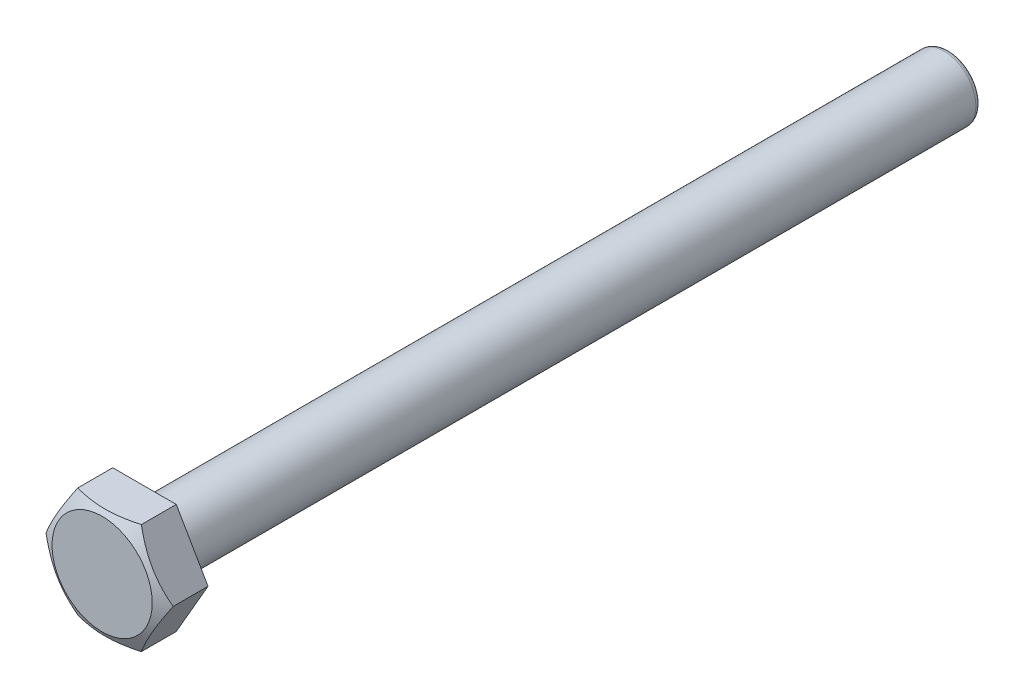
ISO-10303-21;
HEADER;
FILE_DESCRIPTION(('STEP AP214'),'2;1');
FILE_NAME('part.step','',(''),(''),'','','');
FILE_SCHEMA(('AUTOMOTIVE_DESIGN { 1 0 10303 214 1 1 1 1 }'));
ENDSEC;
DATA;
#1=APPLICATION_CONTEXT('core data for automotive mechanical design processes');
#2=APPLICATION_PROTOCOL_DEFINITION('international standard','automotive_design',2000,#1);
#3=PRODUCT_CONTEXT('',#1,'mechanical');
#4=PRODUCT('Part','Part','',(#3));
#5=PRODUCT_RELATED_PRODUCT_CATEGORY('part','',(#4));
#6=PRODUCT_DEFINITION_FORMATION('','',#4);
#7=PRODUCT_DEFINITION_CONTEXT('part definition',#1,'design');
#8=PRODUCT_DEFINITION('design','',#6,#7);
#9=PRODUCT_DEFINITION_SHAPE('','',#8);
#10=(LENGTH_UNIT() NAMED_UNIT(*) SI_UNIT(.MILLI.,.METRE.));
#11=(NAMED_UNIT(*) PLANE_ANGLE_UNIT() SI_UNIT($,.RADIAN.));
#12=(NAMED_UNIT(*) SI_UNIT($,.STERADIAN.) SOLID_ANGLE_UNIT());
#13=UNCERTAINTY_MEASURE_WITH_UNIT(LENGTH_MEASURE(1.E-05),#10,'distance_accuracy_value','');
#14=(GEOMETRIC_REPRESENTATION_CONTEXT(3) GLOBAL_UNCERTAINTY_ASSIGNED_CONTEXT((#13)) GLOBAL_UNIT_ASSIGNED_CONTEXT((#10,
#11,#12)) REPRESENTATION_CONTEXT('',''));
#15=CARTESIAN_POINT('',(0.,0.,0.));
#16=DIRECTION('',(0.,0.,1.));
#17=DIRECTION('',(1.,0.,0.));
#18=AXIS2_PLACEMENT_3D('',#15,#16,#17);
#19=CARTESIAN_POINT('',(3.00000000000005,-5.19615242270659,4.));
#20=DIRECTION('',(-0.866025403784442,0.499999999999995,0.));
#21=DIRECTION('',(-0.499999999999995,-0.866025403784442,0.));
#22=AXIS2_PLACEMENT_3D('',#19,#20,#21);
#23=PLANE('',#22);
#24=CARTESIAN_POINT('',(2.99988452994622,-5.19635242270659,3.29993636752852));
#25=CARTESIAN_POINT('',(3.13120037425521,-4.96890670852461,3.37231821520058));
#26=CARTESIAN_POINT('',(3.26353944494433,-4.73968871426459,3.43812150944553));
#27=CARTESIAN_POINT('',(3.53029736264474,-4.27765044748621,3.55301887201268));
#28=CARTESIAN_POINT('',(3.6647200634845,-4.04482349994109,3.60207677825998));
#29=CARTESIAN_POINT('',(3.93206789695309,-3.58176346908004,3.67871603562647));
#30=CARTESIAN_POINT('',(4.06495857356462,-3.35159006533665,3.70675619592674));
#31=CARTESIAN_POINT('',(4.26473017311514,-3.00557550500584,3.73217837172106));
#32=CARTESIAN_POINT('',(4.33136469480456,-2.89016112790172,3.73788053333798));
#33=CARTESIAN_POINT('',(4.46469401785052,-2.65922796624735,3.74364269272623));
#34=CARTESIAN_POINT('',(4.53138881755607,-2.5437091845567,3.74370284061096));
#35=CARTESIAN_POINT('',(4.71539831783398,-2.224995381,3.7360427664145));
#36=CARTESIAN_POINT('',(4.83266210158002,-2.02188854966408,3.72237485742094));
#37=CARTESIAN_POINT('',(5.06648407118686,-1.61689701837921,3.67845149833568));
#38=CARTESIAN_POINT('',(5.18304158332952,-1.41501348534429,3.64818215602633));
#39=CARTESIAN_POINT('',(5.41730652919732,-1.00925469666888,3.57229441079438));
#40=CARTESIAN_POINT('',(5.53498909636899,-0.805422511162419,3.52637619610927));
#41=CARTESIAN_POINT('',(5.76874191762245,-0.400550748338854,3.42195798803959));
#42=CARTESIAN_POINT('',(5.88481466437232,-0.199506853594004,3.36348048890669));
#43=CARTESIAN_POINT('',(6.00011547005383,0.000199999999999686,3.29993636752853));
#44=B_SPLINE_CURVE_WITH_KNOTS('',3,(#24,#25,#26,#27,#28,#29,#30,#31,#32,#33,#34,#35,#36,#37,#38,
#39,#40,#41,#42,#43),.UNSPECIFIED.,.F.,.F.,(4,2,2,2,2,2,2,2,2,4),(0.,0.817519463468259,
1.63679337331425,2.43761566578922,2.83768454355232,3.23774277694015,3.94183837221327,
4.64652406150167,5.3655497848344,6.08329828274132),.UNSPECIFIED.);
#45=CARTESIAN_POINT('',(3.00000000000006,-5.19615242270659,3.3));
#46=VERTEX_POINT('',#45);
#47=CARTESIAN_POINT('',(5.99999999999999,0.,3.3));
#48=VERTEX_POINT('',#47);
#49=EDGE_CURVE('E88',#46,#48,#44,.T.);
#50=ORIENTED_EDGE('',*,*,#49,.F.);
#51=DIRECTION('',(0.,0.,-1.));
#52=VECTOR('',#51,1.);
#53=CARTESIAN_POINT('',(3.00000000000005,-5.19615242270659,4.));
#54=LINE('',#53,#52);
#55=CARTESIAN_POINT('',(3.00000000000005,-5.19615242270659,0.));
#56=VERTEX_POINT('',#55);
#57=EDGE_CURVE('E59',#46,#56,#54,.T.);
#58=ORIENTED_EDGE('',*,*,#57,.T.);
#59=DIRECTION('',(0.499999999999995,0.866025403784442,0.));
#60=VECTOR('',#59,1.);
#61=CARTESIAN_POINT('',(3.00000000000005,-5.19615242270659,0.));
#62=LINE('',#61,#60);
#63=CARTESIAN_POINT('',(5.99999999999999,0.,0.));
#64=VERTEX_POINT('',#63);
#65=EDGE_CURVE('E95',#56,#64,#62,.T.);
#66=ORIENTED_EDGE('',*,*,#65,.T.);
#67=DIRECTION('',(0.,0.,-1.));
#68=VECTOR('',#67,1.);
#69=CARTESIAN_POINT('',(5.99999999999999,0.,4.));
#70=LINE('',#69,#68);
#71=EDGE_CURVE('E101',#48,#64,#70,.T.);
#72=ORIENTED_EDGE('',*,*,#71,.F.);
#73=EDGE_LOOP('',(#50,#58,#66,#72));
#74=FACE_BOUND('',#73,.T.);
#75=ADVANCED_FACE('F36',(#74),#23,.F.);
#76=CARTESIAN_POINT('',(5.99999999999999,0.,4.));
#77=DIRECTION('',(-0.866025403784438,-0.500000000000001,0.));
#78=DIRECTION('',(0.500000000000001,-0.866025403784438,0.));
#79=AXIS2_PLACEMENT_3D('',#76,#77,#78);
#80=PLANE('',#79);
#81=CARTESIAN_POINT('',(6.00011547005383,-0.000200000000000011,3.29993636752852));
#82=CARTESIAN_POINT('',(5.86879962574484,0.227245714181975,3.37231821520058));
#83=CARTESIAN_POINT('',(5.73646055505571,0.456463708441989,3.43812150944553));
#84=CARTESIAN_POINT('',(5.4697026373553,0.918501975220374,3.55301887201268));
#85=CARTESIAN_POINT('',(5.33527993651553,1.15132892276549,3.60207677825998));
#86=CARTESIAN_POINT('',(5.06793210304695,1.61438895362654,3.67871603562648));
#87=CARTESIAN_POINT('',(4.93504142643541,1.84456235736993,3.70675619592675));
#88=CARTESIAN_POINT('',(4.73526982688489,2.19057691770073,3.73217837172107));
#89=CARTESIAN_POINT('',(4.66863530519547,2.30599129480486,3.73788053333799));
#90=CARTESIAN_POINT('',(4.5353059821495,2.53692445645923,3.74364269272624));
#91=CARTESIAN_POINT('',(4.46861118244395,2.65244323814987,3.74370284061097));
#92=CARTESIAN_POINT('',(4.28460168216604,2.97115704170658,3.73604276641452));
#93=CARTESIAN_POINT('',(4.16733789841999,3.1742638730425,3.72237485742095));
#94=CARTESIAN_POINT('',(3.93351592881314,3.57925540432739,3.67845149833569));
#95=CARTESIAN_POINT('',(3.81695841667048,3.78113893736231,3.64818215602635));
#96=CARTESIAN_POINT('',(3.58269347080267,4.18689772603772,3.57229441079439));
#97=CARTESIAN_POINT('',(3.465010903631,4.39072991154419,3.52637619610928));
#98=CARTESIAN_POINT('',(3.23125808237753,4.79560167436776,3.4219579880396));
#99=CARTESIAN_POINT('',(3.11518533562766,4.99664556911262,3.36348048890669));
#100=CARTESIAN_POINT('',(2.99988452994614,5.19635242270663,3.29993636752853));
#101=B_SPLINE_CURVE_WITH_KNOTS('',3,(#81,#82,#83,#84,#85,#86,#87,#88,#89,#90,#91,#92,#93,#94,
#95,#96,#97,#98,#99,#100),.UNSPECIFIED.,.F.,.F.,(4,2,2,2,2,2,2,2,2,4),(0.,0.817519463468258,
1.63679337331425,2.43761566578922,2.83768454355232,3.23774277694015,3.94183837221328,
4.64652406150171,5.36554978483446,6.0832982827414),.UNSPECIFIED.);
#102=CARTESIAN_POINT('',(2.99999999999998,5.19615242270663,3.3));
#103=VERTEX_POINT('',#102);
#104=EDGE_CURVE('E91',#48,#103,#101,.T.);
#105=ORIENTED_EDGE('',*,*,#104,.F.);
#106=ORIENTED_EDGE('',*,*,#71,.T.);
#107=DIRECTION('',(-0.500000000000001,0.866025403784438,0.));
#108=VECTOR('',#107,1.);
#109=CARTESIAN_POINT('',(5.99999999999999,0.,0.));
#110=LINE('',#109,#108);
#111=CARTESIAN_POINT('',(2.99999999999998,5.19615242270663,0.));
#112=VERTEX_POINT('',#111);
#113=EDGE_CURVE('E210',#64,#112,#110,.T.);
#114=ORIENTED_EDGE('',*,*,#113,.T.);
#115=DIRECTION('',(0.,0.,-1.));
#116=VECTOR('',#115,1.);
#117=CARTESIAN_POINT('',(2.99999999999998,5.19615242270663,4.));
#118=LINE('',#117,#116);
#119=EDGE_CURVE('E103',#103,#112,#118,.T.);
#120=ORIENTED_EDGE('',*,*,#119,.F.);
#121=EDGE_LOOP('',(#105,#106,#114,#120));
#122=FACE_BOUND('',#121,.T.);
#123=ADVANCED_FACE('F99',(#122),#80,.F.);
#124=CARTESIAN_POINT('',(2.99999999999998,5.19615242270663,4.));
#125=DIRECTION('',(0.,-1.,0.));
#126=DIRECTION('',(1.,0.,0.));
#127=AXIS2_PLACEMENT_3D('',#124,#125,#126);
#128=PLANE('',#127);
#129=CARTESIAN_POINT('',(-7.92198431592787,5.19615242270659,1.38559266034994));
#130=CARTESIAN_POINT('',(-7.69326227954885,5.19615242270659,1.49095278034008));
#131=CARTESIAN_POINT('',(-7.46403330139792,5.19615242270659,1.59523252212606));
#132=CARTESIAN_POINT('',(-7.00428906400931,5.19615242270659,1.80101597831413));
#133=CARTESIAN_POINT('',(-6.77377360014843,5.19615242270659,1.90251923501786));
#134=CARTESIAN_POINT('',(-6.31002575217176,5.1961524227066,2.10263157928218));
#135=CARTESIAN_POINT('',(-6.0767854350624,5.1961524227066,2.20122234966374));
#136=CARTESIAN_POINT('',(-5.60851628234075,5.1961524227066,2.39404413592184));
#137=CARTESIAN_POINT('',(-5.37348753503331,5.1961524227066,2.48827536544762));
#138=CARTESIAN_POINT('',(-4.89904131503442,5.1961524227066,2.67209286409355));
#139=CARTESIAN_POINT('',(-4.65960336015394,5.1961524227066,2.7616265569743));
#140=CARTESIAN_POINT('',(-4.17811783883686,5.1961524227066,2.93351382581167));
#141=CARTESIAN_POINT('',(-3.93607001357712,5.1961524227066,3.01586668214091));
#142=CARTESIAN_POINT('',(-3.44949172318917,5.19615242270661,3.17118551715607));
#143=CARTESIAN_POINT('',(-3.2049672843446,5.19615242270661,3.24417018327577));
#144=CARTESIAN_POINT('',(-2.71274475935278,5.19615242270661,3.37838550758616));
#145=CARTESIAN_POINT('',(-2.46504760997054,5.19615242270661,3.43961955361462));
#146=CARTESIAN_POINT('',(-1.96632403136333,5.19615242270661,3.5474117726451));
#147=CARTESIAN_POINT('',(-1.71529638995956,5.19615242270661,3.59396444046187));
#148=CARTESIAN_POINT('',(-1.21052002960329,5.19615242270661,3.66933556405531));
#149=CARTESIAN_POINT('',(-0.956771219161599,5.19615242270661,3.69815342165098));
#150=CARTESIAN_POINT('',(-0.449115035776771,5.19615242270662,3.7356137354557));
#151=CARTESIAN_POINT('',(-0.195215761662992,5.19615242270662,3.74436321942582));
#152=CARTESIAN_POINT('',(0.312390311797005,5.19615242270662,3.7412051851038));
#153=CARTESIAN_POINT('',(0.566097144884676,5.19615242270662,3.72930335153118));
#154=CARTESIAN_POINT('',(1.01176749789605,5.19615242270662,3.69108715053189));
#155=CARTESIAN_POINT('',(1.20409897173807,5.19615242270662,3.66886211887566));
#156=CARTESIAN_POINT('',(1.58729792803549,5.19615242270662,3.61408305260569));
#157=CARTESIAN_POINT('',(1.77816515276921,5.19615242270662,3.58152724054171));
#158=CARTESIAN_POINT('',(2.34892228539402,5.19615242270663,3.47013116561713));
#159=CARTESIAN_POINT('',(2.72616893315937,5.19615242270663,3.37764053263401));
#160=CARTESIAN_POINT('',(3.29043142538852,5.19615242270663,3.21834555065987));
#161=CARTESIAN_POINT('',(3.48030711122072,5.19615242270663,3.16108090431709));
#162=CARTESIAN_POINT('',(3.85830568868335,5.19615242270663,3.04092666432027));
#163=CARTESIAN_POINT('',(4.04642842551327,5.19615242270663,2.97803657899323));
#164=CARTESIAN_POINT('',(4.41994249881478,5.19615242270663,2.84802755076435));
#165=CARTESIAN_POINT('',(4.60534341034003,5.19615242270663,2.78093582891764));
#166=CARTESIAN_POINT('',(4.97466674191132,5.19615242270664,2.64297814233672));
#167=CARTESIAN_POINT('',(5.15858964286321,5.19615242270664,2.57211346761545));
#168=CARTESIAN_POINT('',(5.34189920565052,5.19615242270664,2.49973208755415));
#169=B_SPLINE_CURVE_WITH_KNOTS('',3,(#129,#130,#131,#132,#133,#134,#135,#136,#137,#138,#139,
#140,#141,#142,#143,#144,#145,#146,#147,#148,#149,#150,#151,#152,#153,#154,#155,#156,#157,#158,
#159,#160,#161,#162,#163,#164,#165,#166,#167,#168),.UNSPECIFIED.,.F.,.F.,(4,2,2,2,2,2,2,2,2,2,2,
2,2,2,2,2,2,2,2,4),(0.,0.755476989475552,1.51107777640751,2.27070737140927,3.03029969950886,
3.7971016321675,4.56398032175718,5.32930466697557,6.09440802784875,6.85979794501777,
7.62521367676295,8.38653773982239,9.14765226529749,9.72819096907238,10.308829610956,
11.472503627369,12.0674314382528,12.6624112977505,13.2538710123172,13.8451297831649),.UNSPECIFIED.);
#170=CARTESIAN_POINT('',(-3.00000000000002,5.19615242270661,3.3));
#171=VERTEX_POINT('',#170);
#172=EDGE_CURVE('E104',#103,#171,#169,.F.);
#173=ORIENTED_EDGE('',*,*,#172,.F.);
#174=ORIENTED_EDGE('',*,*,#119,.T.);
#175=DIRECTION('',(-1.,0.,0.));
#176=VECTOR('',#175,1.);
#177=CARTESIAN_POINT('',(2.99999999999998,5.19615242270663,0.));
#178=LINE('',#177,#176);
#179=CARTESIAN_POINT('',(-3.00000000000002,5.19615242270661,0.));
#180=VERTEX_POINT('',#179);
#181=EDGE_CURVE('E211',#112,#180,#178,.T.);
#182=ORIENTED_EDGE('',*,*,#181,.T.);
#183=DIRECTION('',(0.,0.,-1.));
#184=VECTOR('',#183,1.);
#185=CARTESIAN_POINT('',(-3.00000000000002,5.19615242270661,4.));
#186=LINE('',#185,#184);
#187=EDGE_CURVE('E111',#171,#180,#186,.T.);
#188=ORIENTED_EDGE('',*,*,#187,.F.);
#189=EDGE_LOOP('',(#173,#174,#182,#188));
#190=FACE_BOUND('',#189,.T.);
#191=ADVANCED_FACE('F131',(#190),#128,.F.);
#192=CARTESIAN_POINT('',(-3.00000000000002,5.19615242270661,4.));
#193=DIRECTION('',(0.866025403784442,-0.499999999999995,0.));
#194=DIRECTION('',(0.499999999999995,0.866025403784442,0.));
#195=AXIS2_PLACEMENT_3D('',#192,#193,#194);
#196=PLANE('',#195);
#197=CARTESIAN_POINT('',(-2.99988452994618,5.19635242270661,3.29993636752853));
#198=CARTESIAN_POINT('',(-3.13120037425517,4.96890670852463,3.37231821520058));
#199=CARTESIAN_POINT('',(-3.26353944494429,4.73968871426462,3.43812150944553));
#200=CARTESIAN_POINT('',(-3.5302973626447,4.27765044748623,3.55301887201268));
#201=CARTESIAN_POINT('',(-3.66472006348447,4.04482349994112,3.60207677825998));
#202=CARTESIAN_POINT('',(-3.93206789695305,3.58176346908006,3.67871603562648));
#203=CARTESIAN_POINT('',(-4.06495857356459,3.35159006533667,3.70675619592675));
#204=CARTESIAN_POINT('',(-4.26473017311511,3.00557550500586,3.73217837172107));
#205=CARTESIAN_POINT('',(-4.33136469480452,2.89016112790174,3.73788053333799));
#206=CARTESIAN_POINT('',(-4.46469401785049,2.65922796624737,3.74364269272624));
#207=CARTESIAN_POINT('',(-4.53138881755604,2.54370918455672,3.74370284061097));
#208=CARTESIAN_POINT('',(-4.71539831783395,2.22499538100002,3.73604276641452));
#209=CARTESIAN_POINT('',(-4.83266210157999,2.0218885496641,3.72237485742095));
#210=CARTESIAN_POINT('',(-5.06648407118684,1.61689701837921,3.67845149833569));
#211=CARTESIAN_POINT('',(-5.1830415833295,1.41501348534428,3.64818215602635));
#212=CARTESIAN_POINT('',(-5.41730652919731,1.00925469666887,3.57229441079439));
#213=CARTESIAN_POINT('',(-5.53498909636898,0.805422511162398,3.52637619610928));
#214=CARTESIAN_POINT('',(-5.76874191762244,0.400550748338822,3.42195798803959));
#215=CARTESIAN_POINT('',(-5.88481466437231,0.199506853593967,3.36348048890669));
#216=CARTESIAN_POINT('',(-6.00011547005383,-0.000200000000041801,3.29993636752853));
#217=B_SPLINE_CURVE_WITH_KNOTS('',3,(#197,#198,#199,#200,#201,#202,#203,#204,#205,#206,#207,
#208,#209,#210,#211,#212,#213,#214,#215,#216),.UNSPECIFIED.,.F.,.F.,(4,2,2,2,2,2,2,2,2,4),(0.,
0.817519463468259,1.63679337331425,2.43761566578922,2.83768454355232,3.23774277694015,
3.94183837221328,4.64652406150171,5.36554978483446,6.0832982827414),.UNSPECIFIED.);
#218=CARTESIAN_POINT('',(-5.99999999999999,0.,3.3));
#219=VERTEX_POINT('',#218);
#220=EDGE_CURVE('E175',#171,#219,#217,.T.);
#221=ORIENTED_EDGE('',*,*,#220,.F.);
#222=ORIENTED_EDGE('',*,*,#187,.T.);
#223=DIRECTION('',(-0.499999999999995,-0.866025403784442,0.));
#224=VECTOR('',#223,1.);
#225=CARTESIAN_POINT('',(-3.00000000000002,5.19615242270661,0.));
#226=LINE('',#225,#224);
#227=CARTESIAN_POINT('',(-5.99999999999999,0.,0.));
#228=VERTEX_POINT('',#227);
#229=EDGE_CURVE('E213',#180,#228,#226,.T.);
#230=ORIENTED_EDGE('',*,*,#229,.T.);
#231=DIRECTION('',(0.,0.,-1.));
#232=VECTOR('',#231,1.);
#233=CARTESIAN_POINT('',(-5.99999999999999,0.,4.));
#234=LINE('',#233,#232);
#235=EDGE_CURVE('E225',#219,#228,#234,.T.);
#236=ORIENTED_EDGE('',*,*,#235,.F.);
#237=EDGE_LOOP('',(#221,#222,#230,#236));
#238=FACE_BOUND('',#237,.T.);
#239=ADVANCED_FACE('F187',(#238),#196,.F.);
#240=CARTESIAN_POINT('',(-5.99999999999999,0.,4.));
#241=DIRECTION('',(0.866025403784434,0.500000000000007,0.));
#242=DIRECTION('',(-0.500000000000007,0.866025403784435,0.));
#243=AXIS2_PLACEMENT_3D('',#240,#241,#242);
#244=PLANE('',#243);
#245=CARTESIAN_POINT('',(-6.00011547005383,0.000199999999958112,3.29993636752852));
#246=CARTESIAN_POINT('',(-5.86879962574483,-0.227245714182017,3.37231821520058));
#247=CARTESIAN_POINT('',(-5.73646055505571,-0.45646370844203,3.43812150944553));
#248=CARTESIAN_POINT('',(-5.46970263735529,-0.918501975220413,3.55301887201268));
#249=CARTESIAN_POINT('',(-5.33527993651552,-1.15132892276552,3.60207677825998));
#250=CARTESIAN_POINT('',(-5.06793210304693,-1.61438895362657,3.67871603562648));
#251=CARTESIAN_POINT('',(-4.93504142643539,-1.84456235736996,3.70675619592675));
#252=CARTESIAN_POINT('',(-4.73526982688487,-2.19057691770077,3.73217837172107));
#253=CARTESIAN_POINT('',(-4.66863530519545,-2.30599129480489,3.73788053333799));
#254=CARTESIAN_POINT('',(-4.53530598214949,-2.53692445645926,3.74364269272624));
#255=CARTESIAN_POINT('',(-4.46861118244393,-2.6524432381499,3.74370284061097));
#256=CARTESIAN_POINT('',(-4.28460168216602,-2.97115704170661,3.73604276641452));
#257=CARTESIAN_POINT('',(-4.16733789841997,-3.17426387304253,3.72237485742095));
#258=CARTESIAN_POINT('',(-3.93351592881312,-3.57925540432741,3.67845149833569));
#259=CARTESIAN_POINT('',(-3.81695841667045,-3.78113893736233,3.64818215602635));
#260=CARTESIAN_POINT('',(-3.58269347080264,-4.18689772603775,3.57229441079439));
#261=CARTESIAN_POINT('',(-3.46501090363097,-4.39072991154421,3.52637619610928));
#262=CARTESIAN_POINT('',(-3.2312580823775,-4.79560167436779,3.42195798803959));
#263=CARTESIAN_POINT('',(-3.11518533562762,-4.99664556911264,3.36348048890669));
#264=CARTESIAN_POINT('',(-2.99988452994611,-5.19635242270665,3.29993636752853));
#265=B_SPLINE_CURVE_WITH_KNOTS('',3,(#245,#246,#247,#248,#249,#250,#251,#252,#253,#254,#255,
#256,#257,#258,#259,#260,#261,#262,#263,#264),.UNSPECIFIED.,.F.,.F.,(4,2,2,2,2,2,2,2,2,4),(0.,
0.817519463468259,1.63679337331425,2.43761566578922,2.83768454355232,3.23774277694015,
3.94183837221328,4.64652406150171,5.36554978483446,6.0832982827414),.UNSPECIFIED.);
#266=CARTESIAN_POINT('',(-2.99999999999995,-5.19615242270665,3.3));
#267=VERTEX_POINT('',#266);
#268=EDGE_CURVE('E51',#219,#267,#265,.T.);
#269=ORIENTED_EDGE('',*,*,#268,.F.);
#270=ORIENTED_EDGE('',*,*,#235,.T.);
#271=DIRECTION('',(0.500000000000007,-0.866025403784435,0.));
#272=VECTOR('',#271,1.);
#273=CARTESIAN_POINT('',(-5.99999999999999,0.,0.));
#274=LINE('',#273,#272);
#275=CARTESIAN_POINT('',(-2.99999999999995,-5.19615242270665,0.));
#276=VERTEX_POINT('',#275);
#277=EDGE_CURVE('E218',#228,#276,#274,.T.);
#278=ORIENTED_EDGE('',*,*,#277,.T.);
#279=DIRECTION('',(0.,0.,-1.));
#280=VECTOR('',#279,1.);
#281=CARTESIAN_POINT('',(-2.99999999999995,-5.19615242270665,4.));
#282=LINE('',#281,#280);
#283=EDGE_CURVE('E223',#267,#276,#282,.T.);
#284=ORIENTED_EDGE('',*,*,#283,.F.);
#285=EDGE_LOOP('',(#269,#270,#278,#284));
#286=FACE_BOUND('',#285,.T.);
#287=ADVANCED_FACE('F191',(#286),#244,.F.);
#288=CARTESIAN_POINT('',(-2.99999999999995,-5.19615242270665,4.));
#289=DIRECTION('',(0.,1.,0.));
#290=DIRECTION('',(-1.,0.,0.));
#291=AXIS2_PLACEMENT_3D('',#288,#289,#290);
#292=PLANE('',#291);
#293=CARTESIAN_POINT('',(-7.9219843159364,-5.1961524227067,1.38559266034597));
#294=CARTESIAN_POINT('',(-7.69326227955707,-5.1961524227067,1.49095278033629));
#295=CARTESIAN_POINT('',(-7.46403330140585,-5.1961524227067,1.59523252212244));
#296=CARTESIAN_POINT('',(-7.00428906401664,-5.19615242270669,1.80101597831085));
#297=CARTESIAN_POINT('',(-6.77377360015545,-5.19615242270669,1.90251923501476));
#298=CARTESIAN_POINT('',(-6.31002575217818,-5.19615242270668,2.10263157927942));
#299=CARTESIAN_POINT('',(-6.07678543506851,-5.19615242270668,2.20122234966115));
#300=CARTESIAN_POINT('',(-5.60851628234625,-5.19615242270668,2.39404413591958));
#301=CARTESIAN_POINT('',(-5.3734875350385,-5.19615242270667,2.48827536544553));
#302=CARTESIAN_POINT('',(-4.89904131503899,-5.19615242270667,2.6720928640918));
#303=CARTESIAN_POINT('',(-4.6596033601582,-5.19615242270667,2.76162655697271));
#304=CARTESIAN_POINT('',(-4.17811783884049,-5.19615242270666,2.93351382581039));
#305=CARTESIAN_POINT('',(-3.93607001358043,-5.19615242270666,3.01586668213979));
#306=CARTESIAN_POINT('',(-3.44949172319183,-5.19615242270665,3.17118551715524));
#307=CARTESIAN_POINT('',(-3.20496728434694,-5.19615242270665,3.24417018327508));
#308=CARTESIAN_POINT('',(-2.71274475935446,-5.19615242270665,3.37838550758572));
#309=CARTESIAN_POINT('',(-2.46504760997189,-5.19615242270664,3.43961955361429));
#310=CARTESIAN_POINT('',(-1.96632403136384,-5.19615242270664,3.54741177264499));
#311=CARTESIAN_POINT('',(-1.71529638995957,-5.19615242270664,3.59396444046187));
#312=CARTESIAN_POINT('',(-1.21052002960228,-5.19615242270663,3.66933556405544));
#313=CARTESIAN_POINT('',(-0.956771219160083,-5.19615242270663,3.69815342165114));
#314=CARTESIAN_POINT('',(-0.449115035774232,-5.19615242270662,3.73561373545583));
#315=CARTESIAN_POINT('',(-0.195215761659943,-5.19615242270662,3.7443632194259));
#316=CARTESIAN_POINT('',(0.312390311801067,-5.19615242270661,3.74120518510368));
#317=CARTESIAN_POINT('',(0.566097144889241,-5.19615242270661,3.72930335153092));
#318=CARTESIAN_POINT('',(1.01176749790127,-5.19615242270661,3.69108715053135));
#319=CARTESIAN_POINT('',(1.20409897174345,-5.1961524227066,3.668862118875));
#320=CARTESIAN_POINT('',(1.58729792804118,-5.1961524227066,3.61408305260479));
#321=CARTESIAN_POINT('',(1.77816515277504,-5.1961524227066,3.58152724054068));
#322=CARTESIAN_POINT('',(2.34892228540029,-5.19615242270659,3.47013116561572));
#323=CARTESIAN_POINT('',(2.72616893316593,-5.19615242270659,3.37764053263235));
#324=CARTESIAN_POINT('',(3.29043142539551,-5.19615242270658,3.21834555065783));
#325=CARTESIAN_POINT('',(3.48030711122786,-5.19615242270658,3.16108090431492));
#326=CARTESIAN_POINT('',(3.85830568869077,-5.19615242270658,3.04092666431786));
#327=CARTESIAN_POINT('',(4.04642842552084,-5.19615242270658,2.97803657899069));
#328=CARTESIAN_POINT('',(4.41994249882263,-5.19615242270657,2.84802755076157));
#329=CARTESIAN_POINT('',(4.60534341034803,-5.19615242270657,2.78093582891474));
#330=CARTESIAN_POINT('',(4.9746667419196,-5.19615242270657,2.64297814233359));
#331=CARTESIAN_POINT('',(5.15858964287163,-5.19615242270656,2.57211346761221));
#332=CARTESIAN_POINT('',(5.34189920565909,-5.19615242270656,2.4997320875508));
#333=B_SPLINE_CURVE_WITH_KNOTS('',3,(#293,#294,#295,#296,#297,#298,#299,#300,#301,#302,#303,
#304,#305,#306,#307,#308,#309,#310,#311,#312,#313,#314,#315,#316,#317,#318,#319,#320,#321,#322,
#323,#324,#325,#326,#327,#328,#329,#330,#331,#332),.UNSPECIFIED.,.F.,.F.,(4,2,2,2,2,2,2,2,2,2,2,
2,2,2,2,2,2,2,2,4),(0.,0.755476989476585,1.51107777640957,2.27070737141238,3.03029969951301,
3.7971016321727,4.56398032176344,5.32930466698288,6.09440802785712,6.85979794502767,
7.62521367677438,8.38653773983533,9.14765226531196,9.72819096908735,10.3088296109715,
11.4725036273855,12.0674314382699,12.6624112977681,13.2538710123352,13.8451297831835),.UNSPECIFIED.);
#334=EDGE_CURVE('E93',#267,#46,#333,.T.);
#335=ORIENTED_EDGE('',*,*,#334,.F.);
#336=ORIENTED_EDGE('',*,*,#283,.T.);
#337=DIRECTION('',(1.,0.,0.));
#338=VECTOR('',#337,1.);
#339=CARTESIAN_POINT('',(-2.99999999999995,-5.19615242270665,0.));
#340=LINE('',#339,#338);
#341=EDGE_CURVE('E208',#276,#56,#340,.T.);
#342=ORIENTED_EDGE('',*,*,#341,.T.);
#343=ORIENTED_EDGE('',*,*,#57,.F.);
#344=EDGE_LOOP('',(#335,#336,#342,#343));
#345=FACE_BOUND('',#344,.T.);
#346=ADVANCED_FACE('F195',(#345),#292,.F.);
#347=CARTESIAN_POINT('',(0.,0.,0.));
#348=DIRECTION('',(0.,0.,1.));
#349=DIRECTION('',(1.,0.,0.));
#350=AXIS2_PLACEMENT_3D('',#347,#348,#349);
#351=PLANE('',#350);
#352=CARTESIAN_POINT('',(0.,0.,0.));
#353=DIRECTION('',(0.,0.,-1.));
#354=DIRECTION('',(-1.,0.,0.));
#355=AXIS2_PLACEMENT_3D('',#352,#353,#354);
#356=CIRCLE('',#355,3.);
#357=CARTESIAN_POINT('',(-3.,0.,0.));
#358=VERTEX_POINT('',#357);
#359=EDGE_CURVE('E107',#358,#358,#356,.T.);
#360=ORIENTED_EDGE('',*,*,#359,.F.);
#361=EDGE_LOOP('',(#360));
#362=FACE_BOUND('',#361,.T.);
#363=ORIENTED_EDGE('',*,*,#65,.F.);
#364=ORIENTED_EDGE('',*,*,#341,.F.);
#365=ORIENTED_EDGE('',*,*,#277,.F.);
#366=ORIENTED_EDGE('',*,*,#229,.F.);
#367=ORIENTED_EDGE('',*,*,#181,.F.);
#368=ORIENTED_EDGE('',*,*,#113,.F.);
#369=EDGE_LOOP('',(#363,#364,#365,#366,#367,#368));
#370=FACE_BOUND('',#369,.T.);
#371=ADVANCED_FACE('F153',(#362,#370),#351,.F.);
#372=CARTESIAN_POINT('',(0.,0.,4.));
#373=DIRECTION('',(0.,0.,-1.));
#374=DIRECTION('',(-1.,0.,0.));
#375=AXIS2_PLACEMENT_3D('',#372,#373,#374);
#376=CONICAL_SURFACE('',#375,4.72971504798533,1.06714160840094);
#377=CARTESIAN_POINT('',(0.,0.,4.));
#378=DIRECTION('',(0.,0.,1.));
#379=DIRECTION('',(1.,0.,0.));
#380=AXIS2_PLACEMENT_3D('',#377,#378,#379);
#381=CIRCLE('',#380,4.72971504798533);
#382=CARTESIAN_POINT('',(4.72971504798533,0.,4.));
#383=VERTEX_POINT('',#382);
#384=EDGE_CURVE('E231',#383,#383,#381,.T.);
#385=ORIENTED_EDGE('',*,*,#384,.F.);
#386=EDGE_LOOP('',(#385));
#387=FACE_BOUND('',#386,.T.);
#388=ORIENTED_EDGE('',*,*,#49,.T.);
#389=ORIENTED_EDGE('',*,*,#104,.T.);
#390=ORIENTED_EDGE('',*,*,#172,.T.);
#391=ORIENTED_EDGE('',*,*,#220,.T.);
#392=ORIENTED_EDGE('',*,*,#268,.T.);
#393=ORIENTED_EDGE('',*,*,#334,.T.);
#394=EDGE_LOOP('',(#388,#389,#390,#391,#392,#393));
#395=FACE_BOUND('',#394,.T.);
#396=ADVANCED_FACE('F90',(#387,#395),#376,.T.);
#397=CARTESIAN_POINT('',(0.,0.,4.));
#398=DIRECTION('',(0.,0.,1.));
#399=DIRECTION('',(1.,0.,0.));
#400=AXIS2_PLACEMENT_3D('',#397,#398,#399);
#401=PLANE('',#400);
#402=ORIENTED_EDGE('',*,*,#384,.T.);
#403=EDGE_LOOP('',(#402));
#404=FACE_BOUND('',#403,.T.);
#405=ADVANCED_FACE('F152',(#404),#401,.T.);
#406=CARTESIAN_POINT('',(0.,0.,-76.));
#407=DIRECTION('',(0.,0.,1.));
#408=DIRECTION('',(1.,0.,0.));
#409=AXIS2_PLACEMENT_3D('',#406,#407,#408);
#410=CYLINDRICAL_SURFACE('',#409,3.);
#411=CARTESIAN_POINT('',(0.,0.,-75.5));
#412=DIRECTION('',(0.,0.,-1.));
#413=DIRECTION('',(-1.,0.,0.));
#414=AXIS2_PLACEMENT_3D('',#411,#412,#413);
#415=CIRCLE('',#414,3.);
#416=CARTESIAN_POINT('',(-3.,0.,-75.5));
#417=VERTEX_POINT('',#416);
#418=EDGE_CURVE('E11',#417,#417,#415,.F.);
#419=ORIENTED_EDGE('',*,*,#418,.T.);
#420=EDGE_LOOP('',(#419));
#421=FACE_BOUND('',#420,.T.);
#422=ORIENTED_EDGE('',*,*,#359,.T.);
#423=EDGE_LOOP('',(#422));
#424=FACE_BOUND('',#423,.T.);
#425=ADVANCED_FACE('F124',(#421,#424),#410,.T.);
#426=CARTESIAN_POINT('',(0.,0.,-76.));
#427=DIRECTION('',(0.,0.,-1.));
#428=DIRECTION('',(-1.,0.,0.));
#429=AXIS2_PLACEMENT_3D('',#426,#427,#428);
#430=PLANE('',#429);
#431=CARTESIAN_POINT('',(0.,0.,-76.));
#432=DIRECTION('',(0.,0.,-1.));
#433=DIRECTION('',(-1.,0.,0.));
#434=AXIS2_PLACEMENT_3D('',#431,#432,#433);
#435=CIRCLE('',#434,2.5);
#436=CARTESIAN_POINT('',(-2.5,0.,-76.));
#437=VERTEX_POINT('',#436);
#438=EDGE_CURVE('E44',#437,#437,#435,.T.);
#439=ORIENTED_EDGE('',*,*,#438,.T.);
#440=EDGE_LOOP('',(#439));
#441=FACE_BOUND('',#440,.T.);
#442=ADVANCED_FACE('F117',(#441),#430,.T.);
#443=CARTESIAN_POINT('',(0.,0.,-75.5));
#444=DIRECTION('',(0.,0.,-1.));
#445=DIRECTION('',(-1.,0.,0.));
#446=AXIS2_PLACEMENT_3D('',#443,#444,#445);
#447=TOROIDAL_SURFACE('',#446,2.5,0.5);
#448=ORIENTED_EDGE('',*,*,#418,.F.);
#449=EDGE_LOOP('',(#448));
#450=FACE_BOUND('',#449,.T.);
#451=ORIENTED_EDGE('',*,*,#438,.F.);
#452=EDGE_LOOP('',(#451));
#453=FACE_BOUND('',#452,.T.);
#454=ADVANCED_FACE('F38',(#450,#453),#447,.T.);
#455=CLOSED_SHELL('',(#75,#123,#191,#239,#287,#346,#371,#396,#405,#425,#442,#454));
#456=MANIFOLD_SOLID_BREP('B2',#455);
#457=ADVANCED_BREP_SHAPE_REPRESENTATION('',(#18,#456),#14);
#458=SHAPE_DEFINITION_REPRESENTATION(#9,#457);
ENDSEC;
END-ISO-10303-21;
